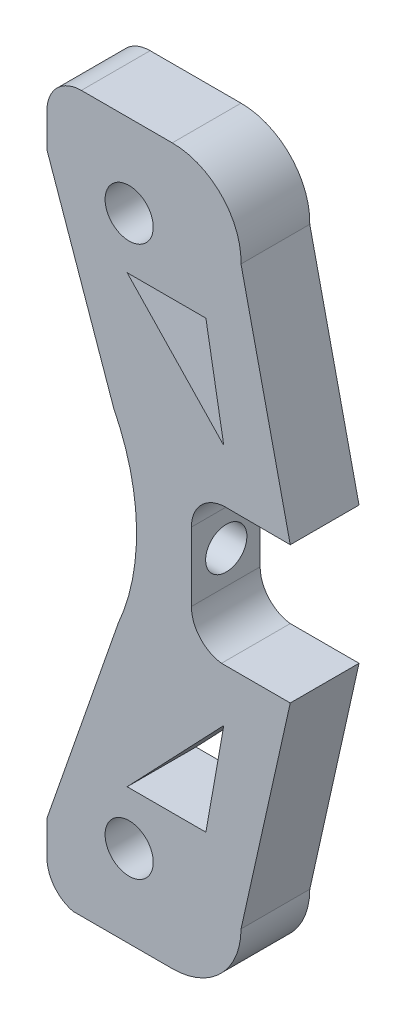
ISO-10303-21;
HEADER;
FILE_DESCRIPTION(('STEP AP214'),'2;1');
FILE_NAME('part.step','',(''),(''),'','','');
FILE_SCHEMA(('AUTOMOTIVE_DESIGN { 1 0 10303 214 1 1 1 1 }'));
ENDSEC;
DATA;
#1=APPLICATION_CONTEXT('core data for automotive mechanical design processes');
#2=APPLICATION_PROTOCOL_DEFINITION('international standard','automotive_design',2000,#1);
#3=PRODUCT_CONTEXT('',#1,'mechanical');
#4=PRODUCT('Part','Part','',(#3));
#5=PRODUCT_RELATED_PRODUCT_CATEGORY('part','',(#4));
#6=PRODUCT_DEFINITION_FORMATION('','',#4);
#7=PRODUCT_DEFINITION_CONTEXT('part definition',#1,'design');
#8=PRODUCT_DEFINITION('design','',#6,#7);
#9=PRODUCT_DEFINITION_SHAPE('','',#8);
#10=(LENGTH_UNIT() NAMED_UNIT(*) SI_UNIT(.MILLI.,.METRE.));
#11=(NAMED_UNIT(*) PLANE_ANGLE_UNIT() SI_UNIT($,.RADIAN.));
#12=(NAMED_UNIT(*) SI_UNIT($,.STERADIAN.) SOLID_ANGLE_UNIT());
#13=UNCERTAINTY_MEASURE_WITH_UNIT(LENGTH_MEASURE(1.E-05),#10,'distance_accuracy_value','');
#14=(GEOMETRIC_REPRESENTATION_CONTEXT(3) GLOBAL_UNCERTAINTY_ASSIGNED_CONTEXT((#13)) GLOBAL_UNIT_ASSIGNED_CONTEXT((#10,
#11,#12)) REPRESENTATION_CONTEXT('',''));
#15=CARTESIAN_POINT('',(0.,0.,0.));
#16=DIRECTION('',(0.,0.,1.));
#17=DIRECTION('',(1.,0.,0.));
#18=AXIS2_PLACEMENT_3D('',#15,#16,#17);
#19=CARTESIAN_POINT('',(-13.9002218715803,48.2113405763736,10.));
#20=DIRECTION('',(0.,0.,1.));
#21=DIRECTION('',(1.,0.,0.));
#22=AXIS2_PLACEMENT_3D('',#19,#20,#21);
#23=PLANE('',#22);
#24=DIRECTION('',(-0.173707129597082,0.984797356377007,0.));
#25=VECTOR('',#24,1.);
#26=CARTESIAN_POINT('',(4.20958108724803,33.5813405763735,10.));
#27=LINE('',#26,#25);
#28=CARTESIAN_POINT('',(6.80883522935296,18.8453961529392,10.));
#29=VERTEX_POINT('',#28);
#30=CARTESIAN_POINT('',(4.20958108724802,33.5813405763735,10.));
#31=VERTEX_POINT('',#30);
#32=EDGE_CURVE('E233',#29,#31,#27,.T.);
#33=ORIENTED_EDGE('',*,*,#32,.F.);
#34=DIRECTION('',(0.69004195196979,-0.723769372467309,0.));
#35=VECTOR('',#34,1.);
#36=CARTESIAN_POINT('',(6.80883522935296,18.8453961529392,10.));
#37=LINE('',#36,#35);
#38=CARTESIAN_POINT('',(-7.24041891275197,33.5813405763736,10.));
#39=VERTEX_POINT('',#38);
#40=EDGE_CURVE('E231',#39,#29,#37,.T.);
#41=ORIENTED_EDGE('',*,*,#40,.F.);
#42=DIRECTION('',(-1.,0.,0.));
#43=VECTOR('',#42,1.);
#44=CARTESIAN_POINT('',(-7.24041891275197,33.5813405763736,10.));
#45=LINE('',#44,#43);
#46=EDGE_CURVE('E237',#31,#39,#45,.T.);
#47=ORIENTED_EDGE('',*,*,#46,.F.);
#48=EDGE_LOOP('',(#33,#41,#47));
#49=FACE_BOUND('',#48,.T.);
#50=CARTESIAN_POINT('',(-6.95022187158033,41.2113405763736,10.));
#51=DIRECTION('',(0.,0.,1.));
#52=DIRECTION('',(1.,0.,0.));
#53=AXIS2_PLACEMENT_3D('',#50,#51,#52);
#54=CIRCLE('',#53,3.50000000000001);
#55=CARTESIAN_POINT('',(-3.45022187158032,41.2113405763736,10.));
#56=VERTEX_POINT('',#55);
#57=EDGE_CURVE('E255',#56,#56,#54,.T.);
#58=ORIENTED_EDGE('',*,*,#57,.F.);
#59=EDGE_LOOP('',(#58));
#60=FACE_BOUND('',#59,.T.);
#61=CARTESIAN_POINT('',(-13.9002218715803,48.2113405763736,10.));
#62=DIRECTION('',(0.,0.,1.));
#63=DIRECTION('',(1.,0.,0.));
#64=AXIS2_PLACEMENT_3D('',#61,#62,#63);
#65=CIRCLE('',#64,5.);
#66=CARTESIAN_POINT('',(-13.9002218715803,53.2113405763736,10.));
#67=VERTEX_POINT('',#66);
#68=CARTESIAN_POINT('',(-18.9002218715803,48.2113405763736,10.));
#69=VERTEX_POINT('',#68);
#70=EDGE_CURVE('E261',#67,#69,#65,.T.);
#71=ORIENTED_EDGE('',*,*,#70,.T.);
#72=DIRECTION('',(0.,-1.,0.));
#73=VECTOR('',#72,1.);
#74=CARTESIAN_POINT('',(-18.9002218715803,48.2113405763736,10.));
#75=LINE('',#74,#73);
#76=CARTESIAN_POINT('',(-18.9002218715803,43.2113405763736,10.));
#77=VERTEX_POINT('',#76);
#78=EDGE_CURVE('E264',#69,#77,#75,.T.);
#79=ORIENTED_EDGE('',*,*,#78,.T.);
#80=DIRECTION('',(0.33084706607532,-0.943684385199497,0.));
#81=VECTOR('',#80,1.);
#82=CARTESIAN_POINT('',(-18.9002218715803,43.2113405763736,10.));
#83=LINE('',#82,#81);
#84=CARTESIAN_POINT('',(-9.19947784012842,15.5416357308898,10.));
#85=VERTEX_POINT('',#84);
#86=EDGE_CURVE('E267',#77,#85,#83,.T.);
#87=ORIENTED_EDGE('',*,*,#86,.T.);
#88=CARTESIAN_POINT('',(-37.3373809266192,1.4558622226975,10.));
#89=DIRECTION('',(0.,0.,-1.));
#90=DIRECTION('',(1.,0.,0.));
#91=AXIS2_PLACEMENT_3D('',#88,#89,#90);
#92=CIRCLE('',#91,31.46665863146);
#93=CARTESIAN_POINT('',(-8.5530402468484,-11.2568218786137,10.));
#94=VERTEX_POINT('',#93);
#95=EDGE_CURVE('E269',#85,#94,#92,.T.);
#96=ORIENTED_EDGE('',*,*,#95,.T.);
#97=DIRECTION('',(-0.329097586940869,-0.944295916685917,0.));
#98=VECTOR('',#97,1.);
#99=CARTESIAN_POINT('',(-18.9002218715803,-40.9464997892496,10.));
#100=LINE('',#99,#98);
#101=CARTESIAN_POINT('',(-18.9002218715803,-40.9464997892496,10.));
#102=VERTEX_POINT('',#101);
#103=EDGE_CURVE('E271',#94,#102,#100,.T.);
#104=ORIENTED_EDGE('',*,*,#103,.T.);
#105=DIRECTION('',(0.,-1.,0.));
#106=VECTOR('',#105,1.);
#107=CARTESIAN_POINT('',(-18.9002218715803,-45.9464997892496,10.));
#108=LINE('',#107,#106);
#109=CARTESIAN_POINT('',(-18.9002218715803,-45.9464997892496,10.));
#110=VERTEX_POINT('',#109);
#111=EDGE_CURVE('E273',#102,#110,#108,.T.);
#112=ORIENTED_EDGE('',*,*,#111,.T.);
#113=CARTESIAN_POINT('',(-13.9002218715803,-45.9464997892496,10.));
#114=DIRECTION('',(0.,0.,1.));
#115=DIRECTION('',(1.,0.,0.));
#116=AXIS2_PLACEMENT_3D('',#113,#114,#115);
#117=CIRCLE('',#116,4.99999999999999);
#118=CARTESIAN_POINT('',(-15.1466126911937,-50.7886594236259,10.));
#119=VERTEX_POINT('',#118);
#120=EDGE_CURVE('E275',#110,#119,#117,.T.);
#121=ORIENTED_EDGE('',*,*,#120,.T.);
#122=DIRECTION('',(1.,0.,0.));
#123=VECTOR('',#122,1.);
#124=CARTESIAN_POINT('',(-15.1466126911937,-50.7886594236259,10.));
#125=LINE('',#124,#123);
#126=CARTESIAN_POINT('',(-0.680221871580316,-50.7886594236259,10.));
#127=VERTEX_POINT('',#126);
#128=EDGE_CURVE('E277',#119,#127,#125,.T.);
#129=ORIENTED_EDGE('',*,*,#128,.T.);
#130=CARTESIAN_POINT('',(-0.680221871580317,-40.7886594236259,10.));
#131=DIRECTION('',(0.,0.,1.));
#132=DIRECTION('',(1.,0.,0.));
#133=AXIS2_PLACEMENT_3D('',#130,#131,#132);
#134=CIRCLE('',#133,10.);
#135=CARTESIAN_POINT('',(9.31977812841971,-40.7886594236259,10.));
#136=VERTEX_POINT('',#135);
#137=EDGE_CURVE('E279',#127,#136,#134,.T.);
#138=ORIENTED_EDGE('',*,*,#137,.T.);
#139=DIRECTION('',(0.218041244325857,0.975939555388976,0.));
#140=VECTOR('',#139,1.);
#141=CARTESIAN_POINT('',(16.4777911249175,-8.74982180430591,10.));
#142=LINE('',#141,#140);
#143=CARTESIAN_POINT('',(16.4777911249175,-8.74982180430591,10.));
#144=VERTEX_POINT('',#143);
#145=EDGE_CURVE('E281',#136,#144,#142,.T.);
#146=ORIENTED_EDGE('',*,*,#145,.T.);
#147=DIRECTION('',(-1.,0.,0.));
#148=VECTOR('',#147,1.);
#149=CARTESIAN_POINT('',(6.47779112491749,-8.74982180430591,10.));
#150=LINE('',#149,#148);
#151=CARTESIAN_POINT('',(6.47779112491749,-8.74982180430591,10.));
#152=VERTEX_POINT('',#151);
#153=EDGE_CURVE('E283',#144,#152,#150,.T.);
#154=ORIENTED_EDGE('',*,*,#153,.T.);
#155=CARTESIAN_POINT('',(7.0997781284197,-3.78865942362592,10.));
#156=DIRECTION('',(0.,0.,-1.));
#157=DIRECTION('',(1.,0.,0.));
#158=AXIS2_PLACEMENT_3D('',#155,#156,#157);
#159=CIRCLE('',#158,5.);
#160=CARTESIAN_POINT('',(2.0997781284197,-3.78865942362592,10.));
#161=VERTEX_POINT('',#160);
#162=EDGE_CURVE('E285',#152,#161,#159,.T.);
#163=ORIENTED_EDGE('',*,*,#162,.T.);
#164=DIRECTION('',(0.,1.,0.));
#165=VECTOR('',#164,1.);
#166=CARTESIAN_POINT('',(2.09977812841969,6.20926138491893,10.));
#167=LINE('',#166,#165);
#168=CARTESIAN_POINT('',(2.09977812841969,6.20926138491893,10.));
#169=VERTEX_POINT('',#168);
#170=EDGE_CURVE('E287',#161,#169,#167,.T.);
#171=ORIENTED_EDGE('',*,*,#170,.T.);
#172=CARTESIAN_POINT('',(7.10185775217855,6.20926138491893,10.));
#173=DIRECTION('',(0.,0.,-1.));
#174=DIRECTION('',(1.,0.,0.));
#175=AXIS2_PLACEMENT_3D('',#172,#173,#174);
#176=CIRCLE('',#175,5.00207962375886);
#177=CARTESIAN_POINT('',(7.09977812841968,11.2113405763741,10.));
#178=VERTEX_POINT('',#177);
#179=EDGE_CURVE('E289',#169,#178,#176,.T.);
#180=ORIENTED_EDGE('',*,*,#179,.T.);
#181=DIRECTION('',(0.99999142472693,-0.00414131290832281,0.));
#182=VECTOR('',#181,1.);
#183=CARTESIAN_POINT('',(7.09977812841968,11.2113405763741,10.));
#184=LINE('',#183,#182);
#185=CARTESIAN_POINT('',(16.4777911249175,11.1725029570541,10.));
#186=VERTEX_POINT('',#185);
#187=EDGE_CURVE('E291',#178,#186,#184,.T.);
#188=ORIENTED_EDGE('',*,*,#187,.T.);
#189=DIRECTION('',(-0.219849558688194,0.975533788007676,0.));
#190=VECTOR('',#189,1.);
#191=CARTESIAN_POINT('',(16.4777911249175,11.1725029570541,10.));
#192=LINE('',#191,#190);
#193=CARTESIAN_POINT('',(9.31635692905425,42.9497831587694,10.));
#194=VERTEX_POINT('',#193);
#195=EDGE_CURVE('E293',#186,#194,#192,.T.);
#196=ORIENTED_EDGE('',*,*,#195,.T.);
#197=CARTESIAN_POINT('',(-0.680221871580312,43.2113405763736,10.));
#198=DIRECTION('',(0.,0.,1.));
#199=DIRECTION('',(1.,0.,0.));
#200=AXIS2_PLACEMENT_3D('',#197,#198,#199);
#201=CIRCLE('',#200,10.);
#202=CARTESIAN_POINT('',(-0.680221871580311,53.2113405763736,10.));
#203=VERTEX_POINT('',#202);
#204=EDGE_CURVE('E295',#194,#203,#201,.T.);
#205=ORIENTED_EDGE('',*,*,#204,.T.);
#206=DIRECTION('',(-1.,0.,0.));
#207=VECTOR('',#206,1.);
#208=CARTESIAN_POINT('',(-0.680221871580313,53.2113405763736,10.));
#209=LINE('',#208,#207);
#210=EDGE_CURVE('E297',#203,#67,#209,.T.);
#211=ORIENTED_EDGE('',*,*,#210,.T.);
#212=EDGE_LOOP('',(#71,#79,#87,#96,#104,#112,#121,#129,#138,#146,#154,#163,#171,#180,#188,#196,
#205,#211));
#213=FACE_BOUND('',#212,.T.);
#214=CARTESIAN_POINT('',(-6.95022187158041,-38.7886594236264,10.));
#215=DIRECTION('',(0.,0.,1.));
#216=DIRECTION('',(-1.,0.,0.));
#217=AXIS2_PLACEMENT_3D('',#214,#215,#216);
#218=CIRCLE('',#217,3.50000000000031);
#219=CARTESIAN_POINT('',(-10.4502218715807,-38.7886594236264,10.));
#220=VERTEX_POINT('',#219);
#221=EDGE_CURVE('E225',#220,#220,#218,.T.);
#222=ORIENTED_EDGE('',*,*,#221,.F.);
#223=EDGE_LOOP('',(#222));
#224=FACE_BOUND('',#223,.T.);
#225=DIRECTION('',(0.173707129597086,0.984797356377007,0.));
#226=VECTOR('',#225,1.);
#227=CARTESIAN_POINT('',(4.20958108724796,-31.1586594236266,10.));
#228=LINE('',#227,#226);
#229=CARTESIAN_POINT('',(4.20958108724796,-31.1586594236266,10.));
#230=VERTEX_POINT('',#229);
#231=CARTESIAN_POINT('',(6.80883522935292,-16.4227150001923,10.));
#232=VERTEX_POINT('',#231);
#233=EDGE_CURVE('E204',#230,#232,#228,.T.);
#234=ORIENTED_EDGE('',*,*,#233,.F.);
#235=DIRECTION('',(1.,0.,0.));
#236=VECTOR('',#235,1.);
#237=CARTESIAN_POINT('',(-7.24041891275197,-31.1586594236267,10.));
#238=LINE('',#237,#236);
#239=CARTESIAN_POINT('',(-7.24041891275197,-31.1586594236267,10.));
#240=VERTEX_POINT('',#239);
#241=EDGE_CURVE('E196',#240,#230,#238,.T.);
#242=ORIENTED_EDGE('',*,*,#241,.F.);
#243=DIRECTION('',(-0.690041951969789,-0.723769372467309,0.));
#244=VECTOR('',#243,1.);
#245=CARTESIAN_POINT('',(6.80883522935292,-16.4227150001923,10.));
#246=LINE('',#245,#244);
#247=EDGE_CURVE('E213',#232,#240,#246,.T.);
#248=ORIENTED_EDGE('',*,*,#247,.F.);
#249=EDGE_LOOP('',(#234,#242,#248));
#250=FACE_BOUND('',#249,.T.);
#251=ADVANCED_FACE('F35',(#49,#60,#213,#224,#250),#23,.T.);
#252=CARTESIAN_POINT('',(-13.9002218715803,48.2113405763736,0.));
#253=DIRECTION('',(0.,0.,1.));
#254=DIRECTION('',(1.,0.,0.));
#255=AXIS2_PLACEMENT_3D('',#252,#253,#254);
#256=PLANE('',#255);
#257=CARTESIAN_POINT('',(-6.95022187158041,-38.7886594236264,0.));
#258=DIRECTION('',(0.,0.,1.));
#259=DIRECTION('',(-1.,0.,0.));
#260=AXIS2_PLACEMENT_3D('',#257,#258,#259);
#261=CIRCLE('',#260,3.50000000000031);
#262=CARTESIAN_POINT('',(-10.4502218715807,-38.7886594236264,0.));
#263=VERTEX_POINT('',#262);
#264=EDGE_CURVE('E211',#263,#263,#261,.T.);
#265=ORIENTED_EDGE('',*,*,#264,.T.);
#266=EDGE_LOOP('',(#265));
#267=FACE_BOUND('',#266,.T.);
#268=DIRECTION('',(0.69004195196979,-0.723769372467309,0.));
#269=VECTOR('',#268,1.);
#270=CARTESIAN_POINT('',(6.80883522935296,18.8453961529392,0.));
#271=LINE('',#270,#269);
#272=CARTESIAN_POINT('',(-7.24041891275197,33.5813405763736,0.));
#273=VERTEX_POINT('',#272);
#274=CARTESIAN_POINT('',(6.80883522935296,18.8453961529392,0.));
#275=VERTEX_POINT('',#274);
#276=EDGE_CURVE('E228',#273,#275,#271,.T.);
#277=ORIENTED_EDGE('',*,*,#276,.T.);
#278=DIRECTION('',(-0.173707129597082,0.984797356377007,0.));
#279=VECTOR('',#278,1.);
#280=CARTESIAN_POINT('',(4.20958108724803,33.5813405763735,0.));
#281=LINE('',#280,#279);
#282=CARTESIAN_POINT('',(4.20958108724803,33.5813405763735,0.));
#283=VERTEX_POINT('',#282);
#284=EDGE_CURVE('E242',#275,#283,#281,.T.);
#285=ORIENTED_EDGE('',*,*,#284,.T.);
#286=DIRECTION('',(-1.,0.,0.));
#287=VECTOR('',#286,1.);
#288=CARTESIAN_POINT('',(-7.24041891275197,33.5813405763736,0.));
#289=LINE('',#288,#287);
#290=EDGE_CURVE('E234',#283,#273,#289,.T.);
#291=ORIENTED_EDGE('',*,*,#290,.T.);
#292=EDGE_LOOP('',(#277,#285,#291));
#293=FACE_BOUND('',#292,.T.);
#294=CARTESIAN_POINT('',(-13.9002218715803,48.2113405763736,0.));
#295=DIRECTION('',(0.,0.,1.));
#296=DIRECTION('',(1.,0.,0.));
#297=AXIS2_PLACEMENT_3D('',#294,#295,#296);
#298=CIRCLE('',#297,5.);
#299=CARTESIAN_POINT('',(-13.9002218715803,53.2113405763736,0.));
#300=VERTEX_POINT('',#299);
#301=CARTESIAN_POINT('',(-18.9002218715803,48.2113405763736,0.));
#302=VERTEX_POINT('',#301);
#303=EDGE_CURVE('E258',#300,#302,#298,.T.);
#304=ORIENTED_EDGE('',*,*,#303,.F.);
#305=DIRECTION('',(-1.,0.,0.));
#306=VECTOR('',#305,1.);
#307=CARTESIAN_POINT('',(-0.680221871580313,53.2113405763736,0.));
#308=LINE('',#307,#306);
#309=CARTESIAN_POINT('',(-0.680221871580311,53.2113405763736,0.));
#310=VERTEX_POINT('',#309);
#311=EDGE_CURVE('E265',#310,#300,#308,.T.);
#312=ORIENTED_EDGE('',*,*,#311,.F.);
#313=CARTESIAN_POINT('',(-0.680221871580312,43.2113405763736,0.));
#314=DIRECTION('',(0.,0.,1.));
#315=DIRECTION('',(1.,0.,0.));
#316=AXIS2_PLACEMENT_3D('',#313,#314,#315);
#317=CIRCLE('',#316,10.);
#318=CARTESIAN_POINT('',(9.31635692905425,42.9497831587694,0.));
#319=VERTEX_POINT('',#318);
#320=EDGE_CURVE('E333',#319,#310,#317,.T.);
#321=ORIENTED_EDGE('',*,*,#320,.F.);
#322=DIRECTION('',(-0.219849558688194,0.975533788007676,0.));
#323=VECTOR('',#322,1.);
#324=CARTESIAN_POINT('',(16.4777911249175,11.1725029570541,0.));
#325=LINE('',#324,#323);
#326=CARTESIAN_POINT('',(16.4777911249175,11.1725029570541,0.));
#327=VERTEX_POINT('',#326);
#328=EDGE_CURVE('E331',#327,#319,#325,.T.);
#329=ORIENTED_EDGE('',*,*,#328,.F.);
#330=DIRECTION('',(0.99999142472693,-0.00414131290832281,0.));
#331=VECTOR('',#330,1.);
#332=CARTESIAN_POINT('',(7.09977812841968,11.2113405763741,0.));
#333=LINE('',#332,#331);
#334=CARTESIAN_POINT('',(7.09977812841968,11.2113405763741,0.));
#335=VERTEX_POINT('',#334);
#336=EDGE_CURVE('E329',#335,#327,#333,.T.);
#337=ORIENTED_EDGE('',*,*,#336,.F.);
#338=CARTESIAN_POINT('',(7.10185775217855,6.20926138491893,0.));
#339=DIRECTION('',(0.,0.,-1.));
#340=DIRECTION('',(1.,0.,0.));
#341=AXIS2_PLACEMENT_3D('',#338,#339,#340);
#342=CIRCLE('',#341,5.00207962375886);
#343=CARTESIAN_POINT('',(2.09977812841969,6.20926138491893,0.));
#344=VERTEX_POINT('',#343);
#345=EDGE_CURVE('E327',#344,#335,#342,.T.);
#346=ORIENTED_EDGE('',*,*,#345,.F.);
#347=DIRECTION('',(0.,1.,0.));
#348=VECTOR('',#347,1.);
#349=CARTESIAN_POINT('',(2.09977812841969,6.20926138491893,0.));
#350=LINE('',#349,#348);
#351=CARTESIAN_POINT('',(2.0997781284197,-3.78865942362592,0.));
#352=VERTEX_POINT('',#351);
#353=EDGE_CURVE('E325',#352,#344,#350,.T.);
#354=ORIENTED_EDGE('',*,*,#353,.F.);
#355=CARTESIAN_POINT('',(7.0997781284197,-3.78865942362592,0.));
#356=DIRECTION('',(0.,0.,-1.));
#357=DIRECTION('',(1.,0.,0.));
#358=AXIS2_PLACEMENT_3D('',#355,#356,#357);
#359=CIRCLE('',#358,5.);
#360=CARTESIAN_POINT('',(6.47779112491749,-8.74982180430591,0.));
#361=VERTEX_POINT('',#360);
#362=EDGE_CURVE('E323',#361,#352,#359,.T.);
#363=ORIENTED_EDGE('',*,*,#362,.F.);
#364=DIRECTION('',(-1.,0.,0.));
#365=VECTOR('',#364,1.);
#366=CARTESIAN_POINT('',(6.47779112491749,-8.74982180430591,0.));
#367=LINE('',#366,#365);
#368=CARTESIAN_POINT('',(16.4777911249175,-8.74982180430591,0.));
#369=VERTEX_POINT('',#368);
#370=EDGE_CURVE('E321',#369,#361,#367,.T.);
#371=ORIENTED_EDGE('',*,*,#370,.F.);
#372=DIRECTION('',(0.218041244325857,0.975939555388976,0.));
#373=VECTOR('',#372,1.);
#374=CARTESIAN_POINT('',(16.4777911249175,-8.74982180430591,0.));
#375=LINE('',#374,#373);
#376=CARTESIAN_POINT('',(9.31977812841971,-40.7886594236259,0.));
#377=VERTEX_POINT('',#376);
#378=EDGE_CURVE('E319',#377,#369,#375,.T.);
#379=ORIENTED_EDGE('',*,*,#378,.F.);
#380=CARTESIAN_POINT('',(-0.680221871580317,-40.7886594236259,0.));
#381=DIRECTION('',(0.,0.,1.));
#382=DIRECTION('',(1.,0.,0.));
#383=AXIS2_PLACEMENT_3D('',#380,#381,#382);
#384=CIRCLE('',#383,10.);
#385=CARTESIAN_POINT('',(-0.680221871580316,-50.7886594236259,0.));
#386=VERTEX_POINT('',#385);
#387=EDGE_CURVE('E317',#386,#377,#384,.T.);
#388=ORIENTED_EDGE('',*,*,#387,.F.);
#389=DIRECTION('',(1.,0.,0.));
#390=VECTOR('',#389,1.);
#391=CARTESIAN_POINT('',(-0.680221871580316,-50.7886594236259,0.));
#392=LINE('',#391,#390);
#393=CARTESIAN_POINT('',(-15.1466126911937,-50.7886594236259,0.));
#394=VERTEX_POINT('',#393);
#395=EDGE_CURVE('E315',#394,#386,#392,.T.);
#396=ORIENTED_EDGE('',*,*,#395,.F.);
#397=CARTESIAN_POINT('',(-13.9002218715803,-45.9464997892496,0.));
#398=DIRECTION('',(0.,0.,1.));
#399=DIRECTION('',(1.,0.,0.));
#400=AXIS2_PLACEMENT_3D('',#397,#398,#399);
#401=CIRCLE('',#400,4.99999999999999);
#402=CARTESIAN_POINT('',(-18.9002218715803,-45.9464997892496,0.));
#403=VERTEX_POINT('',#402);
#404=EDGE_CURVE('E312',#403,#394,#401,.T.);
#405=ORIENTED_EDGE('',*,*,#404,.F.);
#406=DIRECTION('',(0.,-1.,0.));
#407=VECTOR('',#406,1.);
#408=CARTESIAN_POINT('',(-18.9002218715803,-45.9464997892496,0.));
#409=LINE('',#408,#407);
#410=CARTESIAN_POINT('',(-18.9002218715803,-40.9464997892496,0.));
#411=VERTEX_POINT('',#410);
#412=EDGE_CURVE('E310',#411,#403,#409,.T.);
#413=ORIENTED_EDGE('',*,*,#412,.F.);
#414=DIRECTION('',(-0.329097586940869,-0.944295916685917,0.));
#415=VECTOR('',#414,1.);
#416=CARTESIAN_POINT('',(-18.9002218715803,-40.9464997892496,0.));
#417=LINE('',#416,#415);
#418=CARTESIAN_POINT('',(-8.5530402468484,-11.2568218786137,0.));
#419=VERTEX_POINT('',#418);
#420=EDGE_CURVE('E308',#419,#411,#417,.T.);
#421=ORIENTED_EDGE('',*,*,#420,.F.);
#422=CARTESIAN_POINT('',(-37.3373809266192,1.4558622226975,0.));
#423=DIRECTION('',(0.,0.,-1.));
#424=DIRECTION('',(1.,0.,0.));
#425=AXIS2_PLACEMENT_3D('',#422,#423,#424);
#426=CIRCLE('',#425,31.46665863146);
#427=CARTESIAN_POINT('',(-9.19947784012842,15.5416357308898,0.));
#428=VERTEX_POINT('',#427);
#429=EDGE_CURVE('E306',#428,#419,#426,.T.);
#430=ORIENTED_EDGE('',*,*,#429,.F.);
#431=DIRECTION('',(0.33084706607532,-0.943684385199497,0.));
#432=VECTOR('',#431,1.);
#433=CARTESIAN_POINT('',(-18.9002218715803,43.2113405763736,0.));
#434=LINE('',#433,#432);
#435=CARTESIAN_POINT('',(-18.9002218715803,43.2113405763736,0.));
#436=VERTEX_POINT('',#435);
#437=EDGE_CURVE('E304',#436,#428,#434,.T.);
#438=ORIENTED_EDGE('',*,*,#437,.F.);
#439=DIRECTION('',(0.,-1.,0.));
#440=VECTOR('',#439,1.);
#441=CARTESIAN_POINT('',(-18.9002218715803,48.2113405763736,0.));
#442=LINE('',#441,#440);
#443=EDGE_CURVE('E302',#302,#436,#442,.T.);
#444=ORIENTED_EDGE('',*,*,#443,.F.);
#445=EDGE_LOOP('',(#304,#312,#321,#329,#337,#346,#354,#363,#371,#379,#388,#396,#405,#413,#421,
#430,#438,#444));
#446=FACE_BOUND('',#445,.T.);
#447=CARTESIAN_POINT('',(-6.95022187158033,41.2113405763736,0.));
#448=DIRECTION('',(0.,0.,1.));
#449=DIRECTION('',(1.,0.,0.));
#450=AXIS2_PLACEMENT_3D('',#447,#448,#449);
#451=CIRCLE('',#450,3.50000000000001);
#452=CARTESIAN_POINT('',(-3.45022187158032,41.2113405763736,0.));
#453=VERTEX_POINT('',#452);
#454=EDGE_CURVE('E254',#453,#453,#451,.T.);
#455=ORIENTED_EDGE('',*,*,#454,.T.);
#456=EDGE_LOOP('',(#455));
#457=FACE_BOUND('',#456,.T.);
#458=DIRECTION('',(1.,0.,0.));
#459=VECTOR('',#458,1.);
#460=CARTESIAN_POINT('',(-7.24041891275197,-31.1586594236267,0.));
#461=LINE('',#460,#459);
#462=CARTESIAN_POINT('',(-7.24041891275197,-31.1586594236267,0.));
#463=VERTEX_POINT('',#462);
#464=CARTESIAN_POINT('',(4.20958108724796,-31.1586594236266,0.));
#465=VERTEX_POINT('',#464);
#466=EDGE_CURVE('E58',#463,#465,#461,.T.);
#467=ORIENTED_EDGE('',*,*,#466,.T.);
#468=DIRECTION('',(0.173707129597086,0.984797356377007,0.));
#469=VECTOR('',#468,1.);
#470=CARTESIAN_POINT('',(4.20958108724796,-31.1586594236266,0.));
#471=LINE('',#470,#469);
#472=CARTESIAN_POINT('',(6.80883522935292,-16.4227150001923,0.));
#473=VERTEX_POINT('',#472);
#474=EDGE_CURVE('E210',#465,#473,#471,.T.);
#475=ORIENTED_EDGE('',*,*,#474,.T.);
#476=DIRECTION('',(-0.690041951969789,-0.723769372467309,0.));
#477=VECTOR('',#476,1.);
#478=CARTESIAN_POINT('',(6.80883522935292,-16.4227150001923,0.));
#479=LINE('',#478,#477);
#480=EDGE_CURVE('E205',#473,#463,#479,.T.);
#481=ORIENTED_EDGE('',*,*,#480,.T.);
#482=EDGE_LOOP('',(#467,#475,#481));
#483=FACE_BOUND('',#482,.T.);
#484=ADVANCED_FACE('F393',(#267,#293,#446,#457,#483),#256,.F.);
#485=CARTESIAN_POINT('',(-13.9002218715803,48.2113405763736,10.));
#486=DIRECTION('',(0.,0.,-1.));
#487=DIRECTION('',(-1.,0.,0.));
#488=AXIS2_PLACEMENT_3D('',#485,#486,#487);
#489=CYLINDRICAL_SURFACE('',#488,5.);
#490=ORIENTED_EDGE('',*,*,#303,.T.);
#491=DIRECTION('',(0.,0.,-1.));
#492=VECTOR('',#491,1.);
#493=CARTESIAN_POINT('',(-18.9002218715803,48.2113405763736,10.));
#494=LINE('',#493,#492);
#495=EDGE_CURVE('E11',#69,#302,#494,.T.);
#496=ORIENTED_EDGE('',*,*,#495,.F.);
#497=ORIENTED_EDGE('',*,*,#70,.F.);
#498=DIRECTION('',(0.,0.,-1.));
#499=VECTOR('',#498,1.);
#500=CARTESIAN_POINT('',(-13.9002218715803,53.2113405763736,10.));
#501=LINE('',#500,#499);
#502=EDGE_CURVE('E299',#67,#300,#501,.T.);
#503=ORIENTED_EDGE('',*,*,#502,.T.);
#504=EDGE_LOOP('',(#490,#496,#497,#503));
#505=FACE_BOUND('',#504,.T.);
#506=ADVANCED_FACE('F37',(#505),#489,.T.);
#507=CARTESIAN_POINT('',(-18.9002218715803,48.2113405763736,10.));
#508=DIRECTION('',(1.,0.,0.));
#509=DIRECTION('',(0.,1.,0.));
#510=AXIS2_PLACEMENT_3D('',#507,#508,#509);
#511=PLANE('',#510);
#512=ORIENTED_EDGE('',*,*,#443,.T.);
#513=DIRECTION('',(0.,0.,-1.));
#514=VECTOR('',#513,1.);
#515=CARTESIAN_POINT('',(-18.9002218715803,43.2113405763736,10.));
#516=LINE('',#515,#514);
#517=EDGE_CURVE('E43',#77,#436,#516,.T.);
#518=ORIENTED_EDGE('',*,*,#517,.F.);
#519=ORIENTED_EDGE('',*,*,#78,.F.);
#520=ORIENTED_EDGE('',*,*,#495,.T.);
#521=EDGE_LOOP('',(#512,#518,#519,#520));
#522=FACE_BOUND('',#521,.T.);
#523=ADVANCED_FACE('F411',(#522),#511,.F.);
#524=CARTESIAN_POINT('',(-18.9002218715803,43.2113405763736,10.));
#525=DIRECTION('',(0.943684385199497,0.33084706607532,0.));
#526=DIRECTION('',(-0.33084706607532,0.943684385199497,0.));
#527=AXIS2_PLACEMENT_3D('',#524,#525,#526);
#528=PLANE('',#527);
#529=ORIENTED_EDGE('',*,*,#437,.T.);
#530=DIRECTION('',(0.,0.,-1.));
#531=VECTOR('',#530,1.);
#532=CARTESIAN_POINT('',(-9.19947784012842,15.5416357308898,10.));
#533=LINE('',#532,#531);
#534=EDGE_CURVE('E380',#85,#428,#533,.T.);
#535=ORIENTED_EDGE('',*,*,#534,.F.);
#536=ORIENTED_EDGE('',*,*,#86,.F.);
#537=ORIENTED_EDGE('',*,*,#517,.T.);
#538=EDGE_LOOP('',(#529,#535,#536,#537));
#539=FACE_BOUND('',#538,.T.);
#540=ADVANCED_FACE('F387',(#539),#528,.F.);
#541=CARTESIAN_POINT('',(-37.3373809266192,1.4558622226975,10.));
#542=DIRECTION('',(0.,0.,-1.));
#543=DIRECTION('',(-1.,0.,0.));
#544=AXIS2_PLACEMENT_3D('',#541,#542,#543);
#545=CYLINDRICAL_SURFACE('',#544,31.46665863146);
#546=CARTESIAN_POINT('',(-5.97547110441458,4.02125064021746,4.92827788061361));
#547=CARTESIAN_POINT('',(-5.97546932453006,4.02124336287222,5.09650814479428));
#548=CARTESIAN_POINT('',(-5.97429969637035,4.00705260098063,5.2648505273061));
#549=CARTESIAN_POINT('',(-5.96976391138158,3.95065235167793,5.59687468041029));
#550=CARTESIAN_POINT('',(-5.96639531519967,3.90841174719739,5.76055106423425));
#551=CARTESIAN_POINT('',(-5.95789532914563,3.79714047952226,6.07839063347859));
#552=CARTESIAN_POINT('',(-5.95276492332964,3.72812476873739,6.23255907296475));
#553=CARTESIAN_POINT('',(-5.94140080436262,3.56528563682106,6.52709044471329));
#554=CARTESIAN_POINT('',(-5.93516732049178,3.4714673690247,6.66745623650958));
#555=CARTESIAN_POINT('',(-5.92239083770288,3.26142725841909,6.93078502500782));
#556=CARTESIAN_POINT('',(-5.91584718040722,3.1451559879294,7.05370856936196));
#557=CARTESIAN_POINT('',(-5.90333403056574,2.89361240687281,7.27831913912386));
#558=CARTESIAN_POINT('',(-5.8973645603087,2.75833935919671,7.38000534032054));
#559=CARTESIAN_POINT('',(-5.88682391072967,2.47248002495897,7.55932797737153));
#560=CARTESIAN_POINT('',(-5.88225393346629,2.32188072138033,7.63694373926171));
#561=CARTESIAN_POINT('',(-5.87521046897263,2.00973921670333,7.76577608113986));
#562=CARTESIAN_POINT('',(-5.8727369312242,1.84819727939227,7.81699329724517));
#563=CARTESIAN_POINT('',(-5.87035809835081,1.51930437718352,7.89143176234803));
#564=CARTESIAN_POINT('',(-5.87044473357736,1.35197332493005,7.91474073627377));
#565=CARTESIAN_POINT('',(-5.87335068934584,1.01579720493008,7.9329918638897));
#566=CARTESIAN_POINT('',(-5.87616996030433,0.846952164709834,7.92793453227596));
#567=CARTESIAN_POINT('',(-5.88441034374446,0.512940521019918,7.88966523535406));
#568=CARTESIAN_POINT('',(-5.88982554479654,0.347766447875485,7.85651710713503));
#569=CARTESIAN_POINT('',(-5.90284091284934,0.0253559454225848,7.76312585898885));
#570=CARTESIAN_POINT('',(-5.91044112194971,-0.131880330875757,7.70288221698629));
#571=CARTESIAN_POINT('',(-5.92718484236752,-0.434437102100223,7.55682680285782));
#572=CARTESIAN_POINT('',(-5.9363325474571,-0.579723578513246,7.47094505349366));
#573=CARTESIAN_POINT('',(-5.95530400923479,-0.853848252206987,7.27610308846656));
#574=CARTESIAN_POINT('',(-5.96512778586642,-0.982685963943124,7.16714219179173));
#575=CARTESIAN_POINT('',(-5.98454517040933,-1.22082615560796,6.92867891889467));
#576=CARTESIAN_POINT('',(-5.9941376288948,-1.33004369383699,6.79909159956802));
#577=CARTESIAN_POINT('',(-6.01209327588278,-1.52517650269786,6.52334418468883));
#578=CARTESIAN_POINT('',(-6.02045646895811,-1.61109186001396,6.37718415078976));
#579=CARTESIAN_POINT('',(-6.0350981601036,-1.75709677461303,6.07252310248283));
#580=CARTESIAN_POINT('',(-6.04137821670767,-1.81720564940859,5.91403142430972));
#581=CARTESIAN_POINT('',(-6.05121408849354,-1.90993098391746,5.58912032387561));
#582=CARTESIAN_POINT('',(-6.05477000228286,-1.94254843875949,5.42270118880146));
#583=CARTESIAN_POINT('',(-6.05877651682612,-1.97922970054418,5.0875913512235));
#584=CARTESIAN_POINT('',(-6.0592432614539,-1.98344195411317,4.91891708152265));
#585=CARTESIAN_POINT('',(-6.05706604793983,-1.96358254536197,4.5832646797873));
#586=CARTESIAN_POINT('',(-6.05442213950507,-1.93951133500109,4.41628652069258));
#587=CARTESIAN_POINT('',(-6.04630702245926,-1.86388555543563,4.08916793928282));
#588=CARTESIAN_POINT('',(-6.0408425145154,-1.81239611234671,3.92901228112708));
#589=CARTESIAN_POINT('',(-6.02764753839528,-1.68346502607003,3.61961329971276));
#590=CARTESIAN_POINT('',(-6.01991701441031,-1.60602274369465,3.47037024532895));
#591=CARTESIAN_POINT('',(-6.00293384824531,-1.42703799026677,3.18639323129509));
#592=CARTESIAN_POINT('',(-5.99367539364172,-1.32540280693066,3.05171806002936));
#593=CARTESIAN_POINT('',(-5.97457789729478,-1.10105648925245,2.80129035356477));
#594=CARTESIAN_POINT('',(-5.96473883786214,-0.978344712552219,2.68553839530468));
#595=CARTESIAN_POINT('',(-5.94539213664942,-0.714660196840411,2.47570117987097));
#596=CARTESIAN_POINT('',(-5.93588622238057,-0.573606265381364,2.38171775838272));
#597=CARTESIAN_POINT('',(-5.91815890183432,-0.27764303038847,2.21877411408417));
#598=CARTESIAN_POINT('',(-5.9099374858804,-0.122733831244548,2.14981370276247));
#599=CARTESIAN_POINT('',(-5.89553229951995,0.196406714122365,2.03896341330923));
#600=CARTESIAN_POINT('',(-5.88934653218312,0.360628738087098,1.99704696657622));
#601=CARTESIAN_POINT('',(-5.879508764129,0.693855289712965,1.94141603527253));
#602=CARTESIAN_POINT('',(-5.87585669194282,0.862859682336081,1.92770075519962));
#603=CARTESIAN_POINT('',(-5.87131255536136,1.20003551039754,1.92888961709795));
#604=CARTESIAN_POINT('',(-5.87040804008238,1.36820724511049,1.94366415427656));
#605=CARTESIAN_POINT('',(-5.87123033902024,1.69969500166808,2.00116149993239));
#606=CARTESIAN_POINT('',(-5.8729571366689,1.86301105408014,2.04388413243223));
#607=CARTESIAN_POINT('',(-5.87865511309653,2.17993648072098,2.15597516972206));
#608=CARTESIAN_POINT('',(-5.88262329788601,2.33355850029898,2.22530798976585));
#609=CARTESIAN_POINT('',(-5.89218102840192,2.62701070158173,2.38864540185333));
#610=CARTESIAN_POINT('',(-5.89777055117663,2.76684107848394,2.48264964464563));
#611=CARTESIAN_POINT('',(-5.90980521916396,3.02920930062488,2.69300134968113));
#612=CARTESIAN_POINT('',(-5.9162529374616,3.15169276189735,2.80941649325364));
#613=CARTESIAN_POINT('',(-5.92912726630617,3.37544635965726,3.0611609145703));
#614=CARTESIAN_POINT('',(-5.9355538713727,3.47671135998653,3.19649475860427));
#615=CARTESIAN_POINT('',(-5.94756105723124,3.65538017997956,3.48262945130687));
#616=CARTESIAN_POINT('',(-5.95313927083711,3.73271783671996,3.63347167742579));
#617=CARTESIAN_POINT('',(-5.96269870512009,3.86087542612779,3.94594159673958));
#618=CARTESIAN_POINT('',(-5.96668172000899,3.91172517074531,4.10755693269074));
#619=CARTESIAN_POINT('',(-5.97153271953432,3.97274935002066,4.37978837263683));
#620=CARTESIAN_POINT('',(-5.97300186577128,3.99091284935885,4.48866951364489));
#621=CARTESIAN_POINT('',(-5.97497164026585,4.01516586338527,4.70777700749197));
#622=CARTESIAN_POINT('',(-5.97547227112451,4.02125541049934,4.81800335671749));
#623=CARTESIAN_POINT('',(-5.97547110441458,4.02125064021746,4.92827788061361));
#624=B_SPLINE_CURVE_WITH_KNOTS('',3,(#546,#547,#548,#549,#550,#551,#552,#553,#554,#555,#556,
#557,#558,#559,#560,#561,#562,#563,#564,#565,#566,#567,#568,#569,#570,#571,#572,#573,#574,#575,
#576,#577,#578,#579,#580,#581,#582,#583,#584,#585,#586,#587,#588,#589,#590,#591,#592,#593,#594,
#595,#596,#597,#598,#599,#600,#601,#602,#603,#604,#605,#606,#607,#608,#609,#610,#611,#612,#613,
#614,#615,#616,#617,#618,#619,#620,#621,#622,#623),.UNSPECIFIED.,.T.,.F.,(4,2,2,2,2,2,2,2,2,2,2,
2,2,2,2,2,2,2,2,2,2,2,2,2,2,2,2,2,2,2,2,2,2,2,2,2,2,2,4),(0.,0.504288456309798,1.00913728126567,
1.51370458107855,2.01816712703168,2.52375311596938,3.02935872281189,3.5353973963837,
4.0414238755328,4.54585553315057,5.05027803807315,5.55355729387342,6.05684624725632,
6.56152164784086,7.06621194229632,7.57303713515082,8.07986044258641,8.58630370177051,
9.09272862803928,9.59650489396741,10.1002731098462,10.6028500355358,11.1054393400083,
11.6099865918949,12.1145492237601,12.6214266183055,13.1283001941995,13.6346750447317,
14.1410356111796,14.6450980947994,15.1491574045804,15.6525449913209,16.1559254524354,
16.6608506816248,17.165897992595,17.6723296095961,18.1781900032506,18.5087507322853,
18.8393105735642),.UNSPECIFIED.);
#625=CARTESIAN_POINT('',(-5.97547110441458,4.02125064021746,4.92827788061361));
#626=VERTEX_POINT('',#625);
#627=EDGE_CURVE('E219',#626,#626,#624,.T.);
#628=ORIENTED_EDGE('',*,*,#627,.T.);
#629=EDGE_LOOP('',(#628));
#630=FACE_BOUND('',#629,.T.);
#631=ORIENTED_EDGE('',*,*,#429,.T.);
#632=DIRECTION('',(0.,0.,-1.));
#633=VECTOR('',#632,1.);
#634=CARTESIAN_POINT('',(-8.5530402468484,-11.2568218786137,10.));
#635=LINE('',#634,#633);
#636=EDGE_CURVE('E377',#94,#419,#635,.T.);
#637=ORIENTED_EDGE('',*,*,#636,.F.);
#638=ORIENTED_EDGE('',*,*,#95,.F.);
#639=ORIENTED_EDGE('',*,*,#534,.T.);
#640=EDGE_LOOP('',(#631,#637,#638,#639));
#641=FACE_BOUND('',#640,.T.);
#642=ADVANCED_FACE('F399',(#630,#641),#545,.F.);
#643=CARTESIAN_POINT('',(-18.9002218715803,-40.9464997892496,10.));
#644=DIRECTION('',(0.944295916685918,-0.329097586940869,0.));
#645=DIRECTION('',(0.329097586940869,0.944295916685918,0.));
#646=AXIS2_PLACEMENT_3D('',#643,#644,#645);
#647=PLANE('',#646);
#648=ORIENTED_EDGE('',*,*,#420,.T.);
#649=DIRECTION('',(0.,0.,-1.));
#650=VECTOR('',#649,1.);
#651=CARTESIAN_POINT('',(-18.9002218715803,-40.9464997892496,10.));
#652=LINE('',#651,#650);
#653=EDGE_CURVE('E374',#102,#411,#652,.T.);
#654=ORIENTED_EDGE('',*,*,#653,.F.);
#655=ORIENTED_EDGE('',*,*,#103,.F.);
#656=ORIENTED_EDGE('',*,*,#636,.T.);
#657=EDGE_LOOP('',(#648,#654,#655,#656));
#658=FACE_BOUND('',#657,.T.);
#659=ADVANCED_FACE('F403',(#658),#647,.F.);
#660=CARTESIAN_POINT('',(-18.9002218715803,-45.9464997892496,10.));
#661=DIRECTION('',(1.,0.,0.));
#662=DIRECTION('',(0.,0.,-1.));
#663=AXIS2_PLACEMENT_3D('',#660,#661,#662);
#664=PLANE('',#663);
#665=ORIENTED_EDGE('',*,*,#412,.T.);
#666=DIRECTION('',(0.,0.,-1.));
#667=VECTOR('',#666,1.);
#668=CARTESIAN_POINT('',(-18.9002218715803,-45.9464997892496,10.));
#669=LINE('',#668,#667);
#670=EDGE_CURVE('E371',#110,#403,#669,.T.);
#671=ORIENTED_EDGE('',*,*,#670,.F.);
#672=ORIENTED_EDGE('',*,*,#111,.F.);
#673=ORIENTED_EDGE('',*,*,#653,.T.);
#674=EDGE_LOOP('',(#665,#671,#672,#673));
#675=FACE_BOUND('',#674,.T.);
#676=ADVANCED_FACE('F473',(#675),#664,.F.);
#677=CARTESIAN_POINT('',(-13.9002218715803,-45.9464997892496,10.));
#678=DIRECTION('',(0.,0.,-1.));
#679=DIRECTION('',(-1.,0.,0.));
#680=AXIS2_PLACEMENT_3D('',#677,#678,#679);
#681=CYLINDRICAL_SURFACE('',#680,4.99999999999999);
#682=ORIENTED_EDGE('',*,*,#404,.T.);
#683=DIRECTION('',(0.,0.,-1.));
#684=VECTOR('',#683,1.);
#685=CARTESIAN_POINT('',(-15.1466126911937,-50.7886594236259,10.));
#686=LINE('',#685,#684);
#687=EDGE_CURVE('E368',#119,#394,#686,.T.);
#688=ORIENTED_EDGE('',*,*,#687,.F.);
#689=ORIENTED_EDGE('',*,*,#120,.F.);
#690=ORIENTED_EDGE('',*,*,#670,.T.);
#691=EDGE_LOOP('',(#682,#688,#689,#690));
#692=FACE_BOUND('',#691,.T.);
#693=ADVANCED_FACE('F471',(#692),#681,.T.);
#694=CARTESIAN_POINT('',(-0.680221871580316,-50.7886594236259,10.));
#695=DIRECTION('',(0.,1.,0.));
#696=DIRECTION('',(0.,0.,1.));
#697=AXIS2_PLACEMENT_3D('',#694,#695,#696);
#698=PLANE('',#697);
#699=ORIENTED_EDGE('',*,*,#395,.T.);
#700=DIRECTION('',(0.,0.,-1.));
#701=VECTOR('',#700,1.);
#702=CARTESIAN_POINT('',(-0.680221871580316,-50.7886594236259,10.));
#703=LINE('',#702,#701);
#704=EDGE_CURVE('E365',#127,#386,#703,.T.);
#705=ORIENTED_EDGE('',*,*,#704,.F.);
#706=ORIENTED_EDGE('',*,*,#128,.F.);
#707=ORIENTED_EDGE('',*,*,#687,.T.);
#708=EDGE_LOOP('',(#699,#705,#706,#707));
#709=FACE_BOUND('',#708,.T.);
#710=ADVANCED_FACE('F467',(#709),#698,.F.);
#711=CARTESIAN_POINT('',(-0.680221871580317,-40.7886594236259,10.));
#712=DIRECTION('',(0.,0.,-1.));
#713=DIRECTION('',(-1.,0.,0.));
#714=AXIS2_PLACEMENT_3D('',#711,#712,#713);
#715=CYLINDRICAL_SURFACE('',#714,10.);
#716=ORIENTED_EDGE('',*,*,#387,.T.);
#717=DIRECTION('',(0.,0.,-1.));
#718=VECTOR('',#717,1.);
#719=CARTESIAN_POINT('',(9.31977812841971,-40.7886594236259,10.));
#720=LINE('',#719,#718);
#721=EDGE_CURVE('E362',#136,#377,#720,.T.);
#722=ORIENTED_EDGE('',*,*,#721,.F.);
#723=ORIENTED_EDGE('',*,*,#137,.F.);
#724=ORIENTED_EDGE('',*,*,#704,.T.);
#725=EDGE_LOOP('',(#716,#722,#723,#724));
#726=FACE_BOUND('',#725,.T.);
#727=ADVANCED_FACE('F462',(#726),#715,.T.);
#728=CARTESIAN_POINT('',(16.4777911249175,-8.74982180430591,10.));
#729=DIRECTION('',(-0.975939555388976,0.218041244325857,0.));
#730=DIRECTION('',(-0.218041244325857,-0.975939555388976,0.));
#731=AXIS2_PLACEMENT_3D('',#728,#729,#730);
#732=PLANE('',#731);
#733=ORIENTED_EDGE('',*,*,#378,.T.);
#734=DIRECTION('',(0.,0.,-1.));
#735=VECTOR('',#734,1.);
#736=CARTESIAN_POINT('',(16.4777911249175,-8.74982180430591,10.));
#737=LINE('',#736,#735);
#738=EDGE_CURVE('E359',#144,#369,#737,.T.);
#739=ORIENTED_EDGE('',*,*,#738,.F.);
#740=ORIENTED_EDGE('',*,*,#145,.F.);
#741=ORIENTED_EDGE('',*,*,#721,.T.);
#742=EDGE_LOOP('',(#733,#739,#740,#741));
#743=FACE_BOUND('',#742,.T.);
#744=ADVANCED_FACE('F457',(#743),#732,.F.);
#745=CARTESIAN_POINT('',(6.47779112491749,-8.74982180430591,10.));
#746=DIRECTION('',(0.,-1.,0.));
#747=DIRECTION('',(0.,0.,-1.));
#748=AXIS2_PLACEMENT_3D('',#745,#746,#747);
#749=PLANE('',#748);
#750=ORIENTED_EDGE('',*,*,#370,.T.);
#751=DIRECTION('',(0.,0.,-1.));
#752=VECTOR('',#751,1.);
#753=CARTESIAN_POINT('',(6.47779112491749,-8.74982180430591,10.));
#754=LINE('',#753,#752);
#755=EDGE_CURVE('E356',#152,#361,#754,.T.);
#756=ORIENTED_EDGE('',*,*,#755,.F.);
#757=ORIENTED_EDGE('',*,*,#153,.F.);
#758=ORIENTED_EDGE('',*,*,#738,.T.);
#759=EDGE_LOOP('',(#750,#756,#757,#758));
#760=FACE_BOUND('',#759,.T.);
#761=ADVANCED_FACE('F453',(#760),#749,.F.);
#762=CARTESIAN_POINT('',(7.0997781284197,-3.78865942362592,10.));
#763=DIRECTION('',(0.,0.,-1.));
#764=DIRECTION('',(-1.,0.,0.));
#765=AXIS2_PLACEMENT_3D('',#762,#763,#764);
#766=CYLINDRICAL_SURFACE('',#765,5.);
#767=ORIENTED_EDGE('',*,*,#362,.T.);
#768=DIRECTION('',(0.,0.,-1.));
#769=VECTOR('',#768,1.);
#770=CARTESIAN_POINT('',(2.0997781284197,-3.78865942362592,10.));
#771=LINE('',#770,#769);
#772=EDGE_CURVE('E353',#161,#352,#771,.T.);
#773=ORIENTED_EDGE('',*,*,#772,.F.);
#774=ORIENTED_EDGE('',*,*,#162,.F.);
#775=ORIENTED_EDGE('',*,*,#755,.T.);
#776=EDGE_LOOP('',(#767,#773,#774,#775));
#777=FACE_BOUND('',#776,.T.);
#778=ADVANCED_FACE('F448',(#777),#766,.F.);
#779=CARTESIAN_POINT('',(2.09977812841969,6.20926138491893,10.));
#780=DIRECTION('',(-1.,0.,0.));
#781=DIRECTION('',(0.,-1.,0.));
#782=AXIS2_PLACEMENT_3D('',#779,#780,#781);
#783=PLANE('',#782);
#784=CARTESIAN_POINT('',(2.09977812841969,1.02125064021746,4.92827788061361));
#785=DIRECTION('',(1.,0.,0.));
#786=DIRECTION('',(0.,1.,0.));
#787=AXIS2_PLACEMENT_3D('',#784,#785,#786);
#788=CIRCLE('',#787,3.);
#789=CARTESIAN_POINT('',(2.09977812841969,4.02125064021746,4.92827788061361));
#790=VERTEX_POINT('',#789);
#791=EDGE_CURVE('E732',#790,#790,#788,.T.);
#792=ORIENTED_EDGE('',*,*,#791,.F.);
#793=EDGE_LOOP('',(#792));
#794=FACE_BOUND('',#793,.T.);
#795=ORIENTED_EDGE('',*,*,#353,.T.);
#796=DIRECTION('',(0.,0.,-1.));
#797=VECTOR('',#796,1.);
#798=CARTESIAN_POINT('',(2.09977812841969,6.20926138491893,10.));
#799=LINE('',#798,#797);
#800=EDGE_CURVE('E350',#169,#344,#799,.T.);
#801=ORIENTED_EDGE('',*,*,#800,.F.);
#802=ORIENTED_EDGE('',*,*,#170,.F.);
#803=ORIENTED_EDGE('',*,*,#772,.T.);
#804=EDGE_LOOP('',(#795,#801,#802,#803));
#805=FACE_BOUND('',#804,.T.);
#806=ADVANCED_FACE('F442',(#794,#805),#783,.F.);
#807=CARTESIAN_POINT('',(7.10185775217855,6.20926138491893,10.));
#808=DIRECTION('',(0.,0.,-1.));
#809=DIRECTION('',(-1.,0.,0.));
#810=AXIS2_PLACEMENT_3D('',#807,#808,#809);
#811=CYLINDRICAL_SURFACE('',#810,5.00207962375886);
#812=ORIENTED_EDGE('',*,*,#345,.T.);
#813=DIRECTION('',(0.,0.,-1.));
#814=VECTOR('',#813,1.);
#815=CARTESIAN_POINT('',(7.09977812841968,11.2113405763741,10.));
#816=LINE('',#815,#814);
#817=EDGE_CURVE('E347',#178,#335,#816,.T.);
#818=ORIENTED_EDGE('',*,*,#817,.F.);
#819=ORIENTED_EDGE('',*,*,#179,.F.);
#820=ORIENTED_EDGE('',*,*,#800,.T.);
#821=EDGE_LOOP('',(#812,#818,#819,#820));
#822=FACE_BOUND('',#821,.T.);
#823=ADVANCED_FACE('F438',(#822),#811,.F.);
#824=CARTESIAN_POINT('',(7.09977812841968,11.2113405763741,10.));
#825=DIRECTION('',(0.00414131290832281,0.99999142472693,0.));
#826=DIRECTION('',(-0.99999142472693,0.00414131290832281,0.));
#827=AXIS2_PLACEMENT_3D('',#824,#825,#826);
#828=PLANE('',#827);
#829=ORIENTED_EDGE('',*,*,#336,.T.);
#830=DIRECTION('',(0.,0.,-1.));
#831=VECTOR('',#830,1.);
#832=CARTESIAN_POINT('',(16.4777911249175,11.1725029570541,10.));
#833=LINE('',#832,#831);
#834=EDGE_CURVE('E344',#186,#327,#833,.T.);
#835=ORIENTED_EDGE('',*,*,#834,.F.);
#836=ORIENTED_EDGE('',*,*,#187,.F.);
#837=ORIENTED_EDGE('',*,*,#817,.T.);
#838=EDGE_LOOP('',(#829,#835,#836,#837));
#839=FACE_BOUND('',#838,.T.);
#840=ADVANCED_FACE('F433',(#839),#828,.F.);
#841=CARTESIAN_POINT('',(16.4777911249175,11.1725029570541,10.));
#842=DIRECTION('',(-0.975533788007676,-0.219849558688194,0.));
#843=DIRECTION('',(0.219849558688194,-0.975533788007676,0.));
#844=AXIS2_PLACEMENT_3D('',#841,#842,#843);
#845=PLANE('',#844);
#846=ORIENTED_EDGE('',*,*,#328,.T.);
#847=DIRECTION('',(0.,0.,-1.));
#848=VECTOR('',#847,1.);
#849=CARTESIAN_POINT('',(9.31635692905425,42.9497831587694,10.));
#850=LINE('',#849,#848);
#851=EDGE_CURVE('E341',#194,#319,#850,.T.);
#852=ORIENTED_EDGE('',*,*,#851,.F.);
#853=ORIENTED_EDGE('',*,*,#195,.F.);
#854=ORIENTED_EDGE('',*,*,#834,.T.);
#855=EDGE_LOOP('',(#846,#852,#853,#854));
#856=FACE_BOUND('',#855,.T.);
#857=ADVANCED_FACE('F427',(#856),#845,.F.);
#858=CARTESIAN_POINT('',(-0.680221871580312,43.2113405763736,10.));
#859=DIRECTION('',(0.,0.,-1.));
#860=DIRECTION('',(-1.,0.,0.));
#861=AXIS2_PLACEMENT_3D('',#858,#859,#860);
#862=CYLINDRICAL_SURFACE('',#861,10.);
#863=ORIENTED_EDGE('',*,*,#320,.T.);
#864=DIRECTION('',(0.,0.,-1.));
#865=VECTOR('',#864,1.);
#866=CARTESIAN_POINT('',(-0.680221871580311,53.2113405763736,10.));
#867=LINE('',#866,#865);
#868=EDGE_CURVE('E338',#203,#310,#867,.T.);
#869=ORIENTED_EDGE('',*,*,#868,.F.);
#870=ORIENTED_EDGE('',*,*,#204,.F.);
#871=ORIENTED_EDGE('',*,*,#851,.T.);
#872=EDGE_LOOP('',(#863,#869,#870,#871));
#873=FACE_BOUND('',#872,.T.);
#874=ADVANCED_FACE('F423',(#873),#862,.T.);
#875=CARTESIAN_POINT('',(-0.680221871580313,53.2113405763736,10.));
#876=DIRECTION('',(0.,-1.,0.));
#877=DIRECTION('',(0.,0.,-1.));
#878=AXIS2_PLACEMENT_3D('',#875,#876,#877);
#879=PLANE('',#878);
#880=ORIENTED_EDGE('',*,*,#311,.T.);
#881=ORIENTED_EDGE('',*,*,#502,.F.);
#882=ORIENTED_EDGE('',*,*,#210,.F.);
#883=ORIENTED_EDGE('',*,*,#868,.T.);
#884=EDGE_LOOP('',(#880,#881,#882,#883));
#885=FACE_BOUND('',#884,.T.);
#886=ADVANCED_FACE('F418',(#885),#879,.F.);
#887=CARTESIAN_POINT('',(-6.95022187158033,41.2113405763736,10.));
#888=DIRECTION('',(0.,0.,-1.));
#889=DIRECTION('',(-1.,0.,0.));
#890=AXIS2_PLACEMENT_3D('',#887,#888,#889);
#891=CYLINDRICAL_SURFACE('',#890,3.50000000000001);
#892=ORIENTED_EDGE('',*,*,#57,.T.);
#893=EDGE_LOOP('',(#892));
#894=FACE_BOUND('',#893,.T.);
#895=ORIENTED_EDGE('',*,*,#454,.F.);
#896=EDGE_LOOP('',(#895));
#897=FACE_BOUND('',#896,.T.);
#898=ADVANCED_FACE('F493',(#894,#897),#891,.F.);
#899=CARTESIAN_POINT('',(6.80883522935296,18.8453961529392,10.));
#900=DIRECTION('',(0.723769372467309,0.69004195196979,0.));
#901=DIRECTION('',(-0.69004195196979,0.723769372467309,0.));
#902=AXIS2_PLACEMENT_3D('',#899,#900,#901);
#903=PLANE('',#902);
#904=ORIENTED_EDGE('',*,*,#276,.F.);
#905=DIRECTION('',(0.,0.,-1.));
#906=VECTOR('',#905,1.);
#907=CARTESIAN_POINT('',(-7.24041891275197,33.5813405763736,10.));
#908=LINE('',#907,#906);
#909=EDGE_CURVE('E239',#39,#273,#908,.T.);
#910=ORIENTED_EDGE('',*,*,#909,.F.);
#911=ORIENTED_EDGE('',*,*,#40,.T.);
#912=DIRECTION('',(0.,0.,-1.));
#913=VECTOR('',#912,1.);
#914=CARTESIAN_POINT('',(6.80883522935296,18.8453961529392,10.));
#915=LINE('',#914,#913);
#916=EDGE_CURVE('E251',#29,#275,#915,.T.);
#917=ORIENTED_EDGE('',*,*,#916,.T.);
#918=EDGE_LOOP('',(#904,#910,#911,#917));
#919=FACE_BOUND('',#918,.T.);
#920=ADVANCED_FACE('F570',(#919),#903,.T.);
#921=CARTESIAN_POINT('',(4.20958108724803,33.5813405763735,10.));
#922=DIRECTION('',(-0.984797356377007,-0.173707129597082,0.));
#923=DIRECTION('',(0.173707129597082,-0.984797356377007,0.));
#924=AXIS2_PLACEMENT_3D('',#921,#922,#923);
#925=PLANE('',#924);
#926=ORIENTED_EDGE('',*,*,#284,.F.);
#927=ORIENTED_EDGE('',*,*,#916,.F.);
#928=ORIENTED_EDGE('',*,*,#32,.T.);
#929=DIRECTION('',(0.,0.,-1.));
#930=VECTOR('',#929,1.);
#931=CARTESIAN_POINT('',(4.20958108724803,33.5813405763735,10.));
#932=LINE('',#931,#930);
#933=EDGE_CURVE('E249',#31,#283,#932,.T.);
#934=ORIENTED_EDGE('',*,*,#933,.T.);
#935=EDGE_LOOP('',(#926,#927,#928,#934));
#936=FACE_BOUND('',#935,.T.);
#937=ADVANCED_FACE('F577',(#936),#925,.T.);
#938=CARTESIAN_POINT('',(-7.24041891275197,33.5813405763736,10.));
#939=DIRECTION('',(0.,-1.,0.));
#940=DIRECTION('',(1.,0.,0.));
#941=AXIS2_PLACEMENT_3D('',#938,#939,#940);
#942=PLANE('',#941);
#943=ORIENTED_EDGE('',*,*,#290,.F.);
#944=ORIENTED_EDGE('',*,*,#933,.F.);
#945=ORIENTED_EDGE('',*,*,#46,.T.);
#946=ORIENTED_EDGE('',*,*,#909,.T.);
#947=EDGE_LOOP('',(#943,#944,#945,#946));
#948=FACE_BOUND('',#947,.T.);
#949=ADVANCED_FACE('F584',(#948),#942,.T.);
#950=CARTESIAN_POINT('',(-6.95022187158041,-38.7886594236264,10.));
#951=DIRECTION('',(0.,0.,-1.));
#952=DIRECTION('',(-1.,0.,0.));
#953=AXIS2_PLACEMENT_3D('',#950,#951,#952);
#954=CYLINDRICAL_SURFACE('',#953,3.50000000000031);
#955=ORIENTED_EDGE('',*,*,#221,.T.);
#956=EDGE_LOOP('',(#955));
#957=FACE_BOUND('',#956,.T.);
#958=ORIENTED_EDGE('',*,*,#264,.F.);
#959=EDGE_LOOP('',(#958));
#960=FACE_BOUND('',#959,.T.);
#961=ADVANCED_FACE('F592',(#957,#960),#954,.F.);
#962=CARTESIAN_POINT('',(-7.24041891275197,-31.1586594236267,10.));
#963=DIRECTION('',(0.,1.,0.));
#964=DIRECTION('',(-1.,0.,0.));
#965=AXIS2_PLACEMENT_3D('',#962,#963,#964);
#966=PLANE('',#965);
#967=ORIENTED_EDGE('',*,*,#466,.F.);
#968=DIRECTION('',(0.,0.,-1.));
#969=VECTOR('',#968,1.);
#970=CARTESIAN_POINT('',(-7.24041891275197,-31.1586594236267,10.));
#971=LINE('',#970,#969);
#972=EDGE_CURVE('E200',#240,#463,#971,.T.);
#973=ORIENTED_EDGE('',*,*,#972,.F.);
#974=ORIENTED_EDGE('',*,*,#241,.T.);
#975=DIRECTION('',(0.,0.,-1.));
#976=VECTOR('',#975,1.);
#977=CARTESIAN_POINT('',(4.20958108724796,-31.1586594236266,10.));
#978=LINE('',#977,#976);
#979=EDGE_CURVE('E199',#230,#465,#978,.T.);
#980=ORIENTED_EDGE('',*,*,#979,.T.);
#981=EDGE_LOOP('',(#967,#973,#974,#980));
#982=FACE_BOUND('',#981,.T.);
#983=ADVANCED_FACE('F198',(#982),#966,.T.);
#984=CARTESIAN_POINT('',(4.20958108724796,-31.1586594236266,10.));
#985=DIRECTION('',(-0.984797356377007,0.173707129597086,0.));
#986=DIRECTION('',(-0.173707129597086,-0.984797356377007,0.));
#987=AXIS2_PLACEMENT_3D('',#984,#985,#986);
#988=PLANE('',#987);
#989=ORIENTED_EDGE('',*,*,#474,.F.);
#990=ORIENTED_EDGE('',*,*,#979,.F.);
#991=ORIENTED_EDGE('',*,*,#233,.T.);
#992=DIRECTION('',(0.,0.,-1.));
#993=VECTOR('',#992,1.);
#994=CARTESIAN_POINT('',(6.80883522935292,-16.4227150001923,10.));
#995=LINE('',#994,#993);
#996=EDGE_CURVE('E50',#232,#473,#995,.T.);
#997=ORIENTED_EDGE('',*,*,#996,.T.);
#998=EDGE_LOOP('',(#989,#990,#991,#997));
#999=FACE_BOUND('',#998,.T.);
#1000=ADVANCED_FACE('F208',(#999),#988,.T.);
#1001=CARTESIAN_POINT('',(6.80883522935292,-16.4227150001923,10.));
#1002=DIRECTION('',(0.723769372467309,-0.690041951969789,0.));
#1003=DIRECTION('',(0.690041951969789,0.72376937246731,0.));
#1004=AXIS2_PLACEMENT_3D('',#1001,#1002,#1003);
#1005=PLANE('',#1004);
#1006=ORIENTED_EDGE('',*,*,#480,.F.);
#1007=ORIENTED_EDGE('',*,*,#996,.F.);
#1008=ORIENTED_EDGE('',*,*,#247,.T.);
#1009=ORIENTED_EDGE('',*,*,#972,.T.);
#1010=EDGE_LOOP('',(#1006,#1007,#1008,#1009));
#1011=FACE_BOUND('',#1010,.T.);
#1012=ADVANCED_FACE('F613',(#1011),#1005,.T.);
#1013=CARTESIAN_POINT('',(-7.90022187158031,1.02125064021745,4.92827788061361));
#1014=DIRECTION('',(1.,0.,0.));
#1015=DIRECTION('',(0.,1.,0.));
#1016=AXIS2_PLACEMENT_3D('',#1013,#1014,#1015);
#1017=CYLINDRICAL_SURFACE('',#1016,3.);
#1018=ORIENTED_EDGE('',*,*,#791,.T.);
#1019=EDGE_LOOP('',(#1018));
#1020=FACE_BOUND('',#1019,.T.);
#1021=ORIENTED_EDGE('',*,*,#627,.F.);
#1022=EDGE_LOOP('',(#1021));
#1023=FACE_BOUND('',#1022,.T.);
#1024=ADVANCED_FACE('F620',(#1020,#1023),#1017,.F.);
#1025=CLOSED_SHELL('',(#251,#484,#506,#523,#540,#642,#659,#676,#693,#710,#727,#744,#761,#778,
#806,#823,#840,#857,#874,#886,#898,#920,#937,#949,#961,#983,#1000,#1012,#1024));
#1026=MANIFOLD_SOLID_BREP('B2',#1025);
#1027=ADVANCED_BREP_SHAPE_REPRESENTATION('',(#18,#1026),#14);
#1028=SHAPE_DEFINITION_REPRESENTATION(#9,#1027);
ENDSEC;
END-ISO-10303-21;
